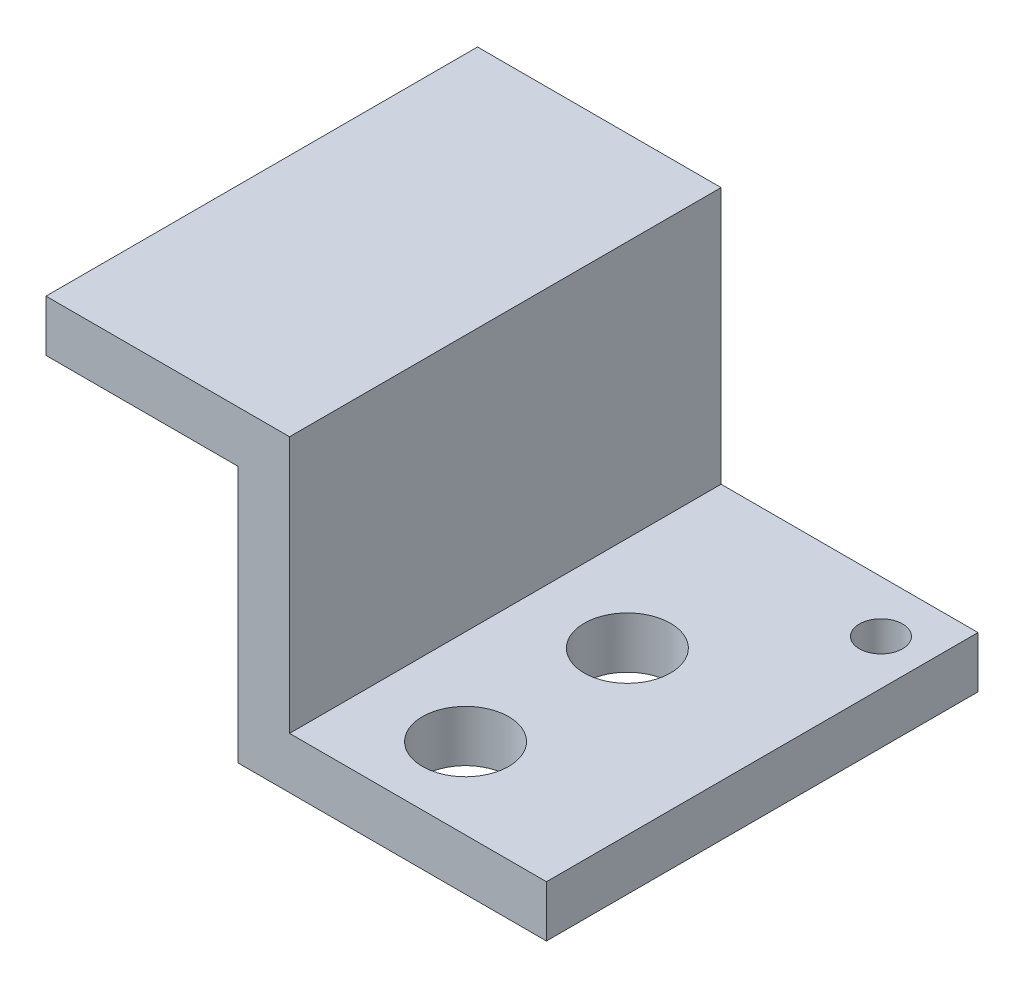
ISO-10303-21;
HEADER;
FILE_DESCRIPTION(('STEP AP214'),'2;1');
FILE_NAME('part.step','',(''),(''),'','','');
FILE_SCHEMA(('AUTOMOTIVE_DESIGN { 1 0 10303 214 1 1 1 1 }'));
ENDSEC;
DATA;
#1=APPLICATION_CONTEXT('core data for automotive mechanical design processes');
#2=APPLICATION_PROTOCOL_DEFINITION('international standard','automotive_design',2000,#1);
#3=PRODUCT_CONTEXT('',#1,'mechanical');
#4=PRODUCT('Part','Part','',(#3));
#5=PRODUCT_RELATED_PRODUCT_CATEGORY('part','',(#4));
#6=PRODUCT_DEFINITION_FORMATION('','',#4);
#7=PRODUCT_DEFINITION_CONTEXT('part definition',#1,'design');
#8=PRODUCT_DEFINITION('design','',#6,#7);
#9=PRODUCT_DEFINITION_SHAPE('','',#8);
#10=(LENGTH_UNIT() NAMED_UNIT(*) SI_UNIT(.MILLI.,.METRE.));
#11=(NAMED_UNIT(*) PLANE_ANGLE_UNIT() SI_UNIT($,.RADIAN.));
#12=(NAMED_UNIT(*) SI_UNIT($,.STERADIAN.) SOLID_ANGLE_UNIT());
#13=UNCERTAINTY_MEASURE_WITH_UNIT(LENGTH_MEASURE(1.E-05),#10,'distance_accuracy_value','');
#14=(GEOMETRIC_REPRESENTATION_CONTEXT(3) GLOBAL_UNCERTAINTY_ASSIGNED_CONTEXT((#13)) GLOBAL_UNIT_ASSIGNED_CONTEXT((#10,
#11,#12)) REPRESENTATION_CONTEXT('',''));
#15=CARTESIAN_POINT('',(0.,0.,0.));
#16=DIRECTION('',(0.,0.,1.));
#17=DIRECTION('',(1.,0.,0.));
#18=AXIS2_PLACEMENT_3D('',#15,#16,#17);
#19=CARTESIAN_POINT('',(2.38125,-9.525,40.));
#20=DIRECTION('',(0.,-1.,0.));
#21=DIRECTION('',(0.,0.,-1.));
#22=AXIS2_PLACEMENT_3D('',#19,#20,#21);
#23=PLANE('',#22);
#24=CARTESIAN_POINT('',(22.0033493,-9.525,4.8026184));
#25=DIRECTION('',(0.,-1.,0.));
#26=DIRECTION('',(0.,0.,-1.));
#27=AXIS2_PLACEMENT_3D('',#24,#25,#26);
#28=CIRCLE('',#27,2.);
#29=CARTESIAN_POINT('',(22.0033493,-9.525,2.8026184));
#30=VERTEX_POINT('',#29);
#31=EDGE_CURVE('E195',#30,#30,#28,.F.);
#32=ORIENTED_EDGE('',*,*,#31,.F.);
#33=EDGE_LOOP('',(#32));
#34=FACE_BOUND('',#33,.T.);
#35=CARTESIAN_POINT('',(11.19375,-9.525,17.5));
#36=DIRECTION('',(0.,-1.,0.));
#37=DIRECTION('',(0.,0.,-1.));
#38=AXIS2_PLACEMENT_3D('',#35,#36,#37);
#39=CIRCLE('',#38,3.99999999999999);
#40=CARTESIAN_POINT('',(11.19375,-9.525,13.5));
#41=VERTEX_POINT('',#40);
#42=EDGE_CURVE('E211',#41,#41,#39,.F.);
#43=ORIENTED_EDGE('',*,*,#42,.F.);
#44=EDGE_LOOP('',(#43));
#45=FACE_BOUND('',#44,.T.);
#46=CARTESIAN_POINT('',(11.19375,-9.525,32.5));
#47=DIRECTION('',(0.,-1.,0.));
#48=DIRECTION('',(0.,0.,-1.));
#49=AXIS2_PLACEMENT_3D('',#46,#47,#48);
#50=CIRCLE('',#49,3.99999999999999);
#51=CARTESIAN_POINT('',(11.19375,-9.525,28.5));
#52=VERTEX_POINT('',#51);
#53=EDGE_CURVE('E212',#52,#52,#50,.F.);
#54=ORIENTED_EDGE('',*,*,#53,.F.);
#55=EDGE_LOOP('',(#54));
#56=FACE_BOUND('',#55,.T.);
#57=DIRECTION('',(-1.,0.,0.));
#58=VECTOR('',#57,1.);
#59=CARTESIAN_POINT('',(2.38125,-9.525,0.));
#60=LINE('',#59,#58);
#61=CARTESIAN_POINT('',(26.19375,-9.525,0.));
#62=VERTEX_POINT('',#61);
#63=CARTESIAN_POINT('',(2.38125,-9.525,0.));
#64=VERTEX_POINT('',#63);
#65=EDGE_CURVE('E146',#62,#64,#60,.T.);
#66=ORIENTED_EDGE('',*,*,#65,.T.);
#67=DIRECTION('',(0.,0.,-1.));
#68=VECTOR('',#67,1.);
#69=CARTESIAN_POINT('',(2.38125,-9.525,40.));
#70=LINE('',#69,#68);
#71=CARTESIAN_POINT('',(2.38125,-9.525,40.));
#72=VERTEX_POINT('',#71);
#73=EDGE_CURVE('E11',#72,#64,#70,.T.);
#74=ORIENTED_EDGE('',*,*,#73,.F.);
#75=DIRECTION('',(-1.,0.,0.));
#76=VECTOR('',#75,1.);
#77=CARTESIAN_POINT('',(2.38125,-9.525,40.));
#78=LINE('',#77,#76);
#79=CARTESIAN_POINT('',(26.19375,-9.525,40.));
#80=VERTEX_POINT('',#79);
#81=EDGE_CURVE('E168',#80,#72,#78,.T.);
#82=ORIENTED_EDGE('',*,*,#81,.F.);
#83=DIRECTION('',(0.,0.,-1.));
#84=VECTOR('',#83,1.);
#85=CARTESIAN_POINT('',(26.19375,-9.525,40.));
#86=LINE('',#85,#84);
#87=EDGE_CURVE('E142',#80,#62,#86,.T.);
#88=ORIENTED_EDGE('',*,*,#87,.T.);
#89=EDGE_LOOP('',(#66,#74,#82,#88));
#90=FACE_BOUND('',#89,.T.);
#91=ADVANCED_FACE('F44',(#34,#45,#56,#90),#23,.F.);
#92=CARTESIAN_POINT('',(2.38125,-9.525,40.));
#93=DIRECTION('',(-1.,0.,0.));
#94=DIRECTION('',(0.,0.,1.));
#95=AXIS2_PLACEMENT_3D('',#92,#93,#94);
#96=PLANE('',#95);
#97=DIRECTION('',(0.,1.,0.));
#98=VECTOR('',#97,1.);
#99=CARTESIAN_POINT('',(2.38125,-9.525,0.));
#100=LINE('',#99,#98);
#101=CARTESIAN_POINT('',(2.38125,14.2875,0.));
#102=VERTEX_POINT('',#101);
#103=EDGE_CURVE('E150',#64,#102,#100,.T.);
#104=ORIENTED_EDGE('',*,*,#103,.T.);
#105=DIRECTION('',(0.,0.,-1.));
#106=VECTOR('',#105,1.);
#107=CARTESIAN_POINT('',(2.38125,14.2875,40.));
#108=LINE('',#107,#106);
#109=CARTESIAN_POINT('',(2.38125,14.2875,40.));
#110=VERTEX_POINT('',#109);
#111=EDGE_CURVE('E52',#110,#102,#108,.T.);
#112=ORIENTED_EDGE('',*,*,#111,.F.);
#113=DIRECTION('',(0.,1.,0.));
#114=VECTOR('',#113,1.);
#115=CARTESIAN_POINT('',(2.38125,-9.525,40.));
#116=LINE('',#115,#114);
#117=EDGE_CURVE('E103',#72,#110,#116,.T.);
#118=ORIENTED_EDGE('',*,*,#117,.F.);
#119=ORIENTED_EDGE('',*,*,#73,.T.);
#120=EDGE_LOOP('',(#104,#112,#118,#119));
#121=FACE_BOUND('',#120,.T.);
#122=ADVANCED_FACE('F255',(#121),#96,.F.);
#123=CARTESIAN_POINT('',(2.38125,14.2875,40.));
#124=DIRECTION('',(0.,-1.,0.));
#125=DIRECTION('',(0.,0.,-1.));
#126=AXIS2_PLACEMENT_3D('',#123,#124,#125);
#127=PLANE('',#126);
#128=DIRECTION('',(-1.,0.,0.));
#129=VECTOR('',#128,1.);
#130=CARTESIAN_POINT('',(2.38125,14.2875,0.));
#131=LINE('',#130,#129);
#132=CARTESIAN_POINT('',(-20.19375,14.2875,0.));
#133=VERTEX_POINT('',#132);
#134=EDGE_CURVE('E154',#102,#133,#131,.T.);
#135=ORIENTED_EDGE('',*,*,#134,.T.);
#136=DIRECTION('',(0.,0.,-1.));
#137=VECTOR('',#136,1.);
#138=CARTESIAN_POINT('',(-20.19375,14.2875,0.));
#139=LINE('',#138,#137);
#140=CARTESIAN_POINT('',(-20.19375,14.2875,40.));
#141=VERTEX_POINT('',#140);
#142=EDGE_CURVE('E59',#141,#133,#139,.T.);
#143=ORIENTED_EDGE('',*,*,#142,.F.);
#144=DIRECTION('',(-1.,0.,0.));
#145=VECTOR('',#144,1.);
#146=CARTESIAN_POINT('',(2.38125,14.2875,40.));
#147=LINE('',#146,#145);
#148=EDGE_CURVE('E180',#110,#141,#147,.T.);
#149=ORIENTED_EDGE('',*,*,#148,.F.);
#150=ORIENTED_EDGE('',*,*,#111,.T.);
#151=EDGE_LOOP('',(#135,#143,#149,#150));
#152=FACE_BOUND('',#151,.T.);
#153=ADVANCED_FACE('F179',(#152),#127,.F.);
#154=CARTESIAN_POINT('',(-2.38125,9.525,40.));
#155=DIRECTION('',(0.,1.,0.));
#156=DIRECTION('',(0.,0.,1.));
#157=AXIS2_PLACEMENT_3D('',#154,#155,#156);
#158=PLANE('',#157);
#159=DIRECTION('',(1.,0.,0.));
#160=VECTOR('',#159,1.);
#161=CARTESIAN_POINT('',(-2.38125,9.525,40.));
#162=LINE('',#161,#160);
#163=CARTESIAN_POINT('',(-20.19375,9.525,40.));
#164=VERTEX_POINT('',#163);
#165=CARTESIAN_POINT('',(-2.38125,9.525,40.));
#166=VERTEX_POINT('',#165);
#167=EDGE_CURVE('E121',#164,#166,#162,.T.);
#168=ORIENTED_EDGE('',*,*,#167,.F.);
#169=DIRECTION('',(0.,0.,1.));
#170=VECTOR('',#169,1.);
#171=CARTESIAN_POINT('',(-20.19375,9.525,0.));
#172=LINE('',#171,#170);
#173=CARTESIAN_POINT('',(-20.19375,9.525,0.));
#174=VERTEX_POINT('',#173);
#175=EDGE_CURVE('E151',#174,#164,#172,.T.);
#176=ORIENTED_EDGE('',*,*,#175,.F.);
#177=DIRECTION('',(1.,0.,0.));
#178=VECTOR('',#177,1.);
#179=CARTESIAN_POINT('',(-2.38125,9.525,0.));
#180=LINE('',#179,#178);
#181=CARTESIAN_POINT('',(-2.38125,9.525,0.));
#182=VERTEX_POINT('',#181);
#183=EDGE_CURVE('E158',#174,#182,#180,.T.);
#184=ORIENTED_EDGE('',*,*,#183,.T.);
#185=DIRECTION('',(0.,0.,-1.));
#186=VECTOR('',#185,1.);
#187=CARTESIAN_POINT('',(-2.38125,9.525,40.));
#188=LINE('',#187,#186);
#189=EDGE_CURVE('E135',#166,#182,#188,.T.);
#190=ORIENTED_EDGE('',*,*,#189,.F.);
#191=EDGE_LOOP('',(#168,#176,#184,#190));
#192=FACE_BOUND('',#191,.T.);
#193=ADVANCED_FACE('F272',(#192),#158,.F.);
#194=CARTESIAN_POINT('',(-2.38125,-14.2875,40.));
#195=DIRECTION('',(1.,0.,0.));
#196=DIRECTION('',(0.,0.,-1.));
#197=AXIS2_PLACEMENT_3D('',#194,#195,#196);
#198=PLANE('',#197);
#199=DIRECTION('',(0.,-1.,0.));
#200=VECTOR('',#199,1.);
#201=CARTESIAN_POINT('',(-2.38125,-14.2875,0.));
#202=LINE('',#201,#200);
#203=CARTESIAN_POINT('',(-2.38125,-14.2875,0.));
#204=VERTEX_POINT('',#203);
#205=EDGE_CURVE('E131',#182,#204,#202,.T.);
#206=ORIENTED_EDGE('',*,*,#205,.T.);
#207=DIRECTION('',(0.,0.,-1.));
#208=VECTOR('',#207,1.);
#209=CARTESIAN_POINT('',(-2.38125,-14.2875,40.));
#210=LINE('',#209,#208);
#211=CARTESIAN_POINT('',(-2.38125,-14.2875,40.));
#212=VERTEX_POINT('',#211);
#213=EDGE_CURVE('E128',#212,#204,#210,.T.);
#214=ORIENTED_EDGE('',*,*,#213,.F.);
#215=DIRECTION('',(0.,-1.,0.));
#216=VECTOR('',#215,1.);
#217=CARTESIAN_POINT('',(-2.38125,-14.2875,40.));
#218=LINE('',#217,#216);
#219=EDGE_CURVE('E112',#166,#212,#218,.T.);
#220=ORIENTED_EDGE('',*,*,#219,.F.);
#221=ORIENTED_EDGE('',*,*,#189,.T.);
#222=EDGE_LOOP('',(#206,#214,#220,#221));
#223=FACE_BOUND('',#222,.T.);
#224=ADVANCED_FACE('F129',(#223),#198,.F.);
#225=CARTESIAN_POINT('',(-2.38125,-14.2875,40.));
#226=DIRECTION('',(0.,1.,0.));
#227=DIRECTION('',(0.,0.,1.));
#228=AXIS2_PLACEMENT_3D('',#225,#226,#227);
#229=PLANE('',#228);
#230=CARTESIAN_POINT('',(22.0033493,-14.2875,4.8026184));
#231=DIRECTION('',(0.,-1.,0.));
#232=DIRECTION('',(0.,0.,1.));
#233=AXIS2_PLACEMENT_3D('',#230,#231,#232);
#234=CIRCLE('',#233,2.);
#235=CARTESIAN_POINT('',(22.0033493,-14.2875,6.8026184));
#236=VERTEX_POINT('',#235);
#237=EDGE_CURVE('E220',#236,#236,#234,.T.);
#238=ORIENTED_EDGE('',*,*,#237,.F.);
#239=EDGE_LOOP('',(#238));
#240=FACE_BOUND('',#239,.T.);
#241=CARTESIAN_POINT('',(11.19375,-14.2875,17.5));
#242=DIRECTION('',(0.,-1.,0.));
#243=DIRECTION('',(0.,0.,1.));
#244=AXIS2_PLACEMENT_3D('',#241,#242,#243);
#245=CIRCLE('',#244,3.99999999999999);
#246=CARTESIAN_POINT('',(11.19375,-14.2875,21.5));
#247=VERTEX_POINT('',#246);
#248=EDGE_CURVE('E216',#247,#247,#245,.T.);
#249=ORIENTED_EDGE('',*,*,#248,.F.);
#250=EDGE_LOOP('',(#249));
#251=FACE_BOUND('',#250,.T.);
#252=CARTESIAN_POINT('',(11.19375,-14.2875,32.5));
#253=DIRECTION('',(0.,-1.,0.));
#254=DIRECTION('',(0.,0.,1.));
#255=AXIS2_PLACEMENT_3D('',#252,#253,#254);
#256=CIRCLE('',#255,3.99999999999999);
#257=CARTESIAN_POINT('',(11.19375,-14.2875,36.5));
#258=VERTEX_POINT('',#257);
#259=EDGE_CURVE('E207',#258,#258,#256,.T.);
#260=ORIENTED_EDGE('',*,*,#259,.F.);
#261=EDGE_LOOP('',(#260));
#262=FACE_BOUND('',#261,.T.);
#263=DIRECTION('',(1.,0.,0.));
#264=VECTOR('',#263,1.);
#265=CARTESIAN_POINT('',(-2.38125,-14.2875,0.));
#266=LINE('',#265,#264);
#267=CARTESIAN_POINT('',(26.19375,-14.2875,0.));
#268=VERTEX_POINT('',#267);
#269=EDGE_CURVE('E163',#204,#268,#266,.T.);
#270=ORIENTED_EDGE('',*,*,#269,.T.);
#271=DIRECTION('',(0.,0.,-1.));
#272=VECTOR('',#271,1.);
#273=CARTESIAN_POINT('',(26.19375,-14.2875,40.));
#274=LINE('',#273,#272);
#275=CARTESIAN_POINT('',(26.19375,-14.2875,40.));
#276=VERTEX_POINT('',#275);
#277=EDGE_CURVE('E136',#276,#268,#274,.T.);
#278=ORIENTED_EDGE('',*,*,#277,.F.);
#279=DIRECTION('',(1.,0.,0.));
#280=VECTOR('',#279,1.);
#281=CARTESIAN_POINT('',(-2.38125,-14.2875,40.));
#282=LINE('',#281,#280);
#283=EDGE_CURVE('E117',#212,#276,#282,.T.);
#284=ORIENTED_EDGE('',*,*,#283,.F.);
#285=ORIENTED_EDGE('',*,*,#213,.T.);
#286=EDGE_LOOP('',(#270,#278,#284,#285));
#287=FACE_BOUND('',#286,.T.);
#288=ADVANCED_FACE('F138',(#240,#251,#262,#287),#229,.F.);
#289=CARTESIAN_POINT('',(26.19375,-9.525,40.));
#290=DIRECTION('',(-1.,0.,0.));
#291=DIRECTION('',(0.,0.,1.));
#292=AXIS2_PLACEMENT_3D('',#289,#290,#291);
#293=PLANE('',#292);
#294=DIRECTION('',(0.,1.,0.));
#295=VECTOR('',#294,1.);
#296=CARTESIAN_POINT('',(26.19375,-9.525,0.));
#297=LINE('',#296,#295);
#298=EDGE_CURVE('E95',#268,#62,#297,.T.);
#299=ORIENTED_EDGE('',*,*,#298,.T.);
#300=ORIENTED_EDGE('',*,*,#87,.F.);
#301=DIRECTION('',(0.,1.,0.));
#302=VECTOR('',#301,1.);
#303=CARTESIAN_POINT('',(26.19375,-9.525,40.));
#304=LINE('',#303,#302);
#305=EDGE_CURVE('E68',#276,#80,#304,.T.);
#306=ORIENTED_EDGE('',*,*,#305,.F.);
#307=ORIENTED_EDGE('',*,*,#277,.T.);
#308=EDGE_LOOP('',(#299,#300,#306,#307));
#309=FACE_BOUND('',#308,.T.);
#310=ADVANCED_FACE('F235',(#309),#293,.F.);
#311=CARTESIAN_POINT('',(0.,0.,40.));
#312=DIRECTION('',(0.,0.,-1.));
#313=DIRECTION('',(-1.,0.,0.));
#314=AXIS2_PLACEMENT_3D('',#311,#312,#313);
#315=PLANE('',#314);
#316=ORIENTED_EDGE('',*,*,#148,.T.);
#317=DIRECTION('',(0.,1.,0.));
#318=VECTOR('',#317,1.);
#319=CARTESIAN_POINT('',(-20.19375,-30.9224968323134,40.));
#320=LINE('',#319,#318);
#321=EDGE_CURVE('E190',#164,#141,#320,.T.);
#322=ORIENTED_EDGE('',*,*,#321,.F.);
#323=ORIENTED_EDGE('',*,*,#167,.T.);
#324=ORIENTED_EDGE('',*,*,#219,.T.);
#325=ORIENTED_EDGE('',*,*,#283,.T.);
#326=ORIENTED_EDGE('',*,*,#305,.T.);
#327=ORIENTED_EDGE('',*,*,#81,.T.);
#328=ORIENTED_EDGE('',*,*,#117,.T.);
#329=EDGE_LOOP('',(#316,#322,#323,#324,#325,#326,#327,#328));
#330=FACE_BOUND('',#329,.T.);
#331=ADVANCED_FACE('F115',(#330),#315,.F.);
#332=CARTESIAN_POINT('',(0.,0.,0.));
#333=DIRECTION('',(0.,0.,-1.));
#334=DIRECTION('',(-1.,0.,0.));
#335=AXIS2_PLACEMENT_3D('',#332,#333,#334);
#336=PLANE('',#335);
#337=DIRECTION('',(0.,1.,0.));
#338=VECTOR('',#337,1.);
#339=CARTESIAN_POINT('',(-20.19375,-30.9224968323134,0.));
#340=LINE('',#339,#338);
#341=EDGE_CURVE('E185',#174,#133,#340,.T.);
#342=ORIENTED_EDGE('',*,*,#341,.T.);
#343=ORIENTED_EDGE('',*,*,#134,.F.);
#344=ORIENTED_EDGE('',*,*,#103,.F.);
#345=ORIENTED_EDGE('',*,*,#65,.F.);
#346=ORIENTED_EDGE('',*,*,#298,.F.);
#347=ORIENTED_EDGE('',*,*,#269,.F.);
#348=ORIENTED_EDGE('',*,*,#205,.F.);
#349=ORIENTED_EDGE('',*,*,#183,.F.);
#350=EDGE_LOOP('',(#342,#343,#344,#345,#346,#347,#348,#349));
#351=FACE_BOUND('',#350,.T.);
#352=ADVANCED_FACE('F182',(#351),#336,.T.);
#353=CARTESIAN_POINT('',(-20.19375,-30.9224968323134,0.));
#354=DIRECTION('',(1.,0.,0.));
#355=DIRECTION('',(0.,0.,-1.));
#356=AXIS2_PLACEMENT_3D('',#353,#354,#355);
#357=PLANE('',#356);
#358=ORIENTED_EDGE('',*,*,#175,.T.);
#359=ORIENTED_EDGE('',*,*,#321,.T.);
#360=ORIENTED_EDGE('',*,*,#142,.T.);
#361=ORIENTED_EDGE('',*,*,#341,.F.);
#362=EDGE_LOOP('',(#358,#359,#360,#361));
#363=FACE_BOUND('',#362,.T.);
#364=ADVANCED_FACE('F244',(#363),#357,.F.);
#365=CARTESIAN_POINT('',(11.19375,1.78870849898474,32.5));
#366=DIRECTION('',(0.,-1.,0.));
#367=DIRECTION('',(0.,0.,-1.));
#368=AXIS2_PLACEMENT_3D('',#365,#366,#367);
#369=CYLINDRICAL_SURFACE('',#368,3.99999999999999);
#370=ORIENTED_EDGE('',*,*,#53,.T.);
#371=EDGE_LOOP('',(#370));
#372=FACE_BOUND('',#371,.T.);
#373=ORIENTED_EDGE('',*,*,#259,.T.);
#374=EDGE_LOOP('',(#373));
#375=FACE_BOUND('',#374,.T.);
#376=ADVANCED_FACE('F241',(#372,#375),#369,.F.);
#377=CARTESIAN_POINT('',(11.19375,1.78870849898474,17.5));
#378=DIRECTION('',(0.,-1.,0.));
#379=DIRECTION('',(0.,0.,-1.));
#380=AXIS2_PLACEMENT_3D('',#377,#378,#379);
#381=CYLINDRICAL_SURFACE('',#380,3.99999999999999);
#382=ORIENTED_EDGE('',*,*,#42,.T.);
#383=EDGE_LOOP('',(#382));
#384=FACE_BOUND('',#383,.T.);
#385=ORIENTED_EDGE('',*,*,#248,.T.);
#386=EDGE_LOOP('',(#385));
#387=FACE_BOUND('',#386,.T.);
#388=ADVANCED_FACE('F243',(#384,#387),#381,.F.);
#389=CARTESIAN_POINT('',(22.0033493,1.78870849898474,4.8026184));
#390=DIRECTION('',(0.,-1.,0.));
#391=DIRECTION('',(0.,0.,-1.));
#392=AXIS2_PLACEMENT_3D('',#389,#390,#391);
#393=CYLINDRICAL_SURFACE('',#392,2.);
#394=ORIENTED_EDGE('',*,*,#31,.T.);
#395=EDGE_LOOP('',(#394));
#396=FACE_BOUND('',#395,.T.);
#397=ORIENTED_EDGE('',*,*,#237,.T.);
#398=EDGE_LOOP('',(#397));
#399=FACE_BOUND('',#398,.T.);
#400=ADVANCED_FACE('F231',(#396,#399),#393,.F.);
#401=CLOSED_SHELL('',(#91,#122,#153,#193,#224,#288,#310,#331,#352,#364,#376,#388,#400));
#402=MANIFOLD_SOLID_BREP('B2',#401);
#403=ADVANCED_BREP_SHAPE_REPRESENTATION('',(#18,#402),#14);
#404=SHAPE_DEFINITION_REPRESENTATION(#9,#403);
ENDSEC;
END-ISO-10303-21;
